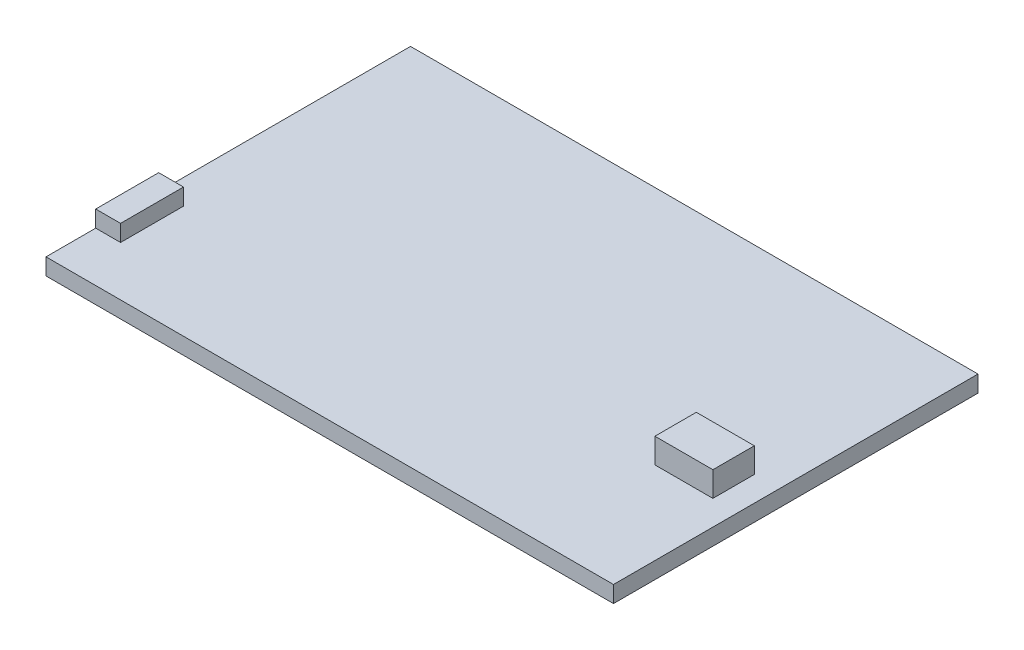
ISO-10303-21;
HEADER;
FILE_DESCRIPTION(('STEP AP214'),'2;1');
FILE_NAME('part.step','',(''),(''),'','','');
FILE_SCHEMA(('AUTOMOTIVE_DESIGN { 1 0 10303 214 1 1 1 1 }'));
ENDSEC;
DATA;
#1=APPLICATION_CONTEXT('core data for automotive mechanical design processes');
#2=APPLICATION_PROTOCOL_DEFINITION('international standard','automotive_design',2000,#1);
#3=PRODUCT_CONTEXT('',#1,'mechanical');
#4=PRODUCT('Part','Part','',(#3));
#5=PRODUCT_RELATED_PRODUCT_CATEGORY('part','',(#4));
#6=PRODUCT_DEFINITION_FORMATION('','',#4);
#7=PRODUCT_DEFINITION_CONTEXT('part definition',#1,'design');
#8=PRODUCT_DEFINITION('design','',#6,#7);
#9=PRODUCT_DEFINITION_SHAPE('','',#8);
#10=(LENGTH_UNIT() NAMED_UNIT(*) SI_UNIT(.MILLI.,.METRE.));
#11=(NAMED_UNIT(*) PLANE_ANGLE_UNIT() SI_UNIT($,.RADIAN.));
#12=(NAMED_UNIT(*) SI_UNIT($,.STERADIAN.) SOLID_ANGLE_UNIT());
#13=UNCERTAINTY_MEASURE_WITH_UNIT(LENGTH_MEASURE(1.E-05),#10,'distance_accuracy_value','');
#14=(GEOMETRIC_REPRESENTATION_CONTEXT(3) GLOBAL_UNCERTAINTY_ASSIGNED_CONTEXT((#13)) GLOBAL_UNIT_ASSIGNED_CONTEXT((#10,
#11,#12)) REPRESENTATION_CONTEXT('',''));
#15=CARTESIAN_POINT('',(0.,0.,0.));
#16=DIRECTION('',(0.,0.,1.));
#17=DIRECTION('',(1.,0.,0.));
#18=AXIS2_PLACEMENT_3D('',#15,#16,#17);
#19=CARTESIAN_POINT('',(0.,2.,0.));
#20=DIRECTION('',(0.,-1.,0.));
#21=DIRECTION('',(0.,0.,-1.));
#22=AXIS2_PLACEMENT_3D('',#19,#20,#21);
#23=PLANE('',#22);
#24=DIRECTION('',(0.,0.,-1.));
#25=VECTOR('',#24,1.);
#26=CARTESIAN_POINT('',(31.25,2.,1.99999999999999));
#27=LINE('',#26,#25);
#28=CARTESIAN_POINT('',(31.25,2.,7.));
#29=VERTEX_POINT('',#28);
#30=CARTESIAN_POINT('',(31.25,2.,1.99999999999999));
#31=VERTEX_POINT('',#30);
#32=EDGE_CURVE('E144',#29,#31,#27,.T.);
#33=ORIENTED_EDGE('',*,*,#32,.F.);
#34=DIRECTION('',(1.,0.,0.));
#35=VECTOR('',#34,1.);
#36=CARTESIAN_POINT('',(31.25,2.,7.));
#37=LINE('',#36,#35);
#38=CARTESIAN_POINT('',(24.25,2.,7.));
#39=VERTEX_POINT('',#38);
#40=EDGE_CURVE('E157',#39,#29,#37,.T.);
#41=ORIENTED_EDGE('',*,*,#40,.F.);
#42=DIRECTION('',(0.,0.,1.));
#43=VECTOR('',#42,1.);
#44=CARTESIAN_POINT('',(24.25,2.,2.));
#45=LINE('',#44,#43);
#46=CARTESIAN_POINT('',(24.25,2.,2.));
#47=VERTEX_POINT('',#46);
#48=EDGE_CURVE('E166',#47,#39,#45,.T.);
#49=ORIENTED_EDGE('',*,*,#48,.F.);
#50=DIRECTION('',(-1.,0.,0.));
#51=VECTOR('',#50,1.);
#52=CARTESIAN_POINT('',(31.25,2.,1.99999999999999));
#53=LINE('',#52,#51);
#54=EDGE_CURVE('E147',#31,#47,#53,.T.);
#55=ORIENTED_EDGE('',*,*,#54,.F.);
#56=EDGE_LOOP('',(#33,#41,#49,#55));
#57=FACE_BOUND('',#56,.T.);
#58=DIRECTION('',(1.,0.,0.));
#59=VECTOR('',#58,1.);
#60=CARTESIAN_POINT('',(-34.25,2.,16.));
#61=LINE('',#60,#59);
#62=CARTESIAN_POINT('',(-34.25,2.,16.));
#63=VERTEX_POINT('',#62);
#64=CARTESIAN_POINT('',(-31.25,2.,16.));
#65=VERTEX_POINT('',#64);
#66=EDGE_CURVE('E221',#63,#65,#61,.T.);
#67=ORIENTED_EDGE('',*,*,#66,.F.);
#68=DIRECTION('',(0.,0.,1.));
#69=VECTOR('',#68,1.);
#70=CARTESIAN_POINT('',(-34.25,2.,22.));
#71=LINE('',#70,#69);
#72=CARTESIAN_POINT('',(-34.25,2.,22.));
#73=VERTEX_POINT('',#72);
#74=EDGE_CURVE('E143',#63,#73,#71,.T.);
#75=ORIENTED_EDGE('',*,*,#74,.T.);
#76=DIRECTION('',(1.,0.,0.));
#77=VECTOR('',#76,1.);
#78=CARTESIAN_POINT('',(-34.25,2.,22.));
#79=LINE('',#78,#77);
#80=CARTESIAN_POINT('',(34.25,2.,22.));
#81=VERTEX_POINT('',#80);
#82=EDGE_CURVE('E191',#73,#81,#79,.T.);
#83=ORIENTED_EDGE('',*,*,#82,.T.);
#84=DIRECTION('',(0.,0.,-1.));
#85=VECTOR('',#84,1.);
#86=CARTESIAN_POINT('',(34.25,2.,22.));
#87=LINE('',#86,#85);
#88=CARTESIAN_POINT('',(34.25,2.,-22.));
#89=VERTEX_POINT('',#88);
#90=EDGE_CURVE('E183',#81,#89,#87,.T.);
#91=ORIENTED_EDGE('',*,*,#90,.T.);
#92=DIRECTION('',(-1.,0.,0.));
#93=VECTOR('',#92,1.);
#94=CARTESIAN_POINT('',(-34.25,2.,-22.));
#95=LINE('',#94,#93);
#96=CARTESIAN_POINT('',(-34.25,2.,-22.));
#97=VERTEX_POINT('',#96);
#98=EDGE_CURVE('E186',#89,#97,#95,.T.);
#99=ORIENTED_EDGE('',*,*,#98,.T.);
#100=CARTESIAN_POINT('',(-34.25,2.,8.4));
#101=VERTEX_POINT('',#100);
#102=EDGE_CURVE('E189',#97,#101,#71,.T.);
#103=ORIENTED_EDGE('',*,*,#102,.T.);
#104=DIRECTION('',(-1.,0.,0.));
#105=VECTOR('',#104,1.);
#106=CARTESIAN_POINT('',(-34.25,2.,8.4));
#107=LINE('',#106,#105);
#108=CARTESIAN_POINT('',(-31.25,2.,8.4));
#109=VERTEX_POINT('',#108);
#110=EDGE_CURVE('E53',#109,#101,#107,.T.);
#111=ORIENTED_EDGE('',*,*,#110,.F.);
#112=DIRECTION('',(0.,0.,-1.));
#113=VECTOR('',#112,1.);
#114=CARTESIAN_POINT('',(-31.25,2.,16.));
#115=LINE('',#114,#113);
#116=EDGE_CURVE('E48',#65,#109,#115,.T.);
#117=ORIENTED_EDGE('',*,*,#116,.F.);
#118=EDGE_LOOP('',(#67,#75,#83,#91,#99,#103,#111,#117));
#119=FACE_BOUND('',#118,.T.);
#120=ADVANCED_FACE('F33',(#57,#119),#23,.F.);
#121=CARTESIAN_POINT('',(34.25,2.,22.));
#122=DIRECTION('',(-1.,0.,0.));
#123=DIRECTION('',(0.,0.,1.));
#124=AXIS2_PLACEMENT_3D('',#121,#122,#123);
#125=PLANE('',#124);
#126=DIRECTION('',(0.,0.,-1.));
#127=VECTOR('',#126,1.);
#128=CARTESIAN_POINT('',(34.25,0.,22.));
#129=LINE('',#128,#127);
#130=CARTESIAN_POINT('',(34.25,0.,22.));
#131=VERTEX_POINT('',#130);
#132=CARTESIAN_POINT('',(34.25,0.,-22.));
#133=VERTEX_POINT('',#132);
#134=EDGE_CURVE('E182',#131,#133,#129,.T.);
#135=ORIENTED_EDGE('',*,*,#134,.T.);
#136=DIRECTION('',(0.,-1.,0.));
#137=VECTOR('',#136,1.);
#138=CARTESIAN_POINT('',(34.25,2.,-22.));
#139=LINE('',#138,#137);
#140=EDGE_CURVE('E11',#89,#133,#139,.T.);
#141=ORIENTED_EDGE('',*,*,#140,.F.);
#142=ORIENTED_EDGE('',*,*,#90,.F.);
#143=DIRECTION('',(0.,-1.,0.));
#144=VECTOR('',#143,1.);
#145=CARTESIAN_POINT('',(34.25,2.,22.));
#146=LINE('',#145,#144);
#147=EDGE_CURVE('E193',#81,#131,#146,.T.);
#148=ORIENTED_EDGE('',*,*,#147,.T.);
#149=EDGE_LOOP('',(#135,#141,#142,#148));
#150=FACE_BOUND('',#149,.T.);
#151=ADVANCED_FACE('F35',(#150),#125,.F.);
#152=CARTESIAN_POINT('',(-34.25,2.,-22.));
#153=DIRECTION('',(0.,0.,1.));
#154=DIRECTION('',(1.,0.,0.));
#155=AXIS2_PLACEMENT_3D('',#152,#153,#154);
#156=PLANE('',#155);
#157=DIRECTION('',(-1.,0.,0.));
#158=VECTOR('',#157,1.);
#159=CARTESIAN_POINT('',(-34.25,0.,-22.));
#160=LINE('',#159,#158);
#161=CARTESIAN_POINT('',(-34.25,0.,-22.));
#162=VERTEX_POINT('',#161);
#163=EDGE_CURVE('E196',#133,#162,#160,.T.);
#164=ORIENTED_EDGE('',*,*,#163,.T.);
#165=DIRECTION('',(0.,-1.,0.));
#166=VECTOR('',#165,1.);
#167=CARTESIAN_POINT('',(-34.25,2.,-22.));
#168=LINE('',#167,#166);
#169=EDGE_CURVE('E41',#97,#162,#168,.T.);
#170=ORIENTED_EDGE('',*,*,#169,.F.);
#171=ORIENTED_EDGE('',*,*,#98,.F.);
#172=ORIENTED_EDGE('',*,*,#140,.T.);
#173=EDGE_LOOP('',(#164,#170,#171,#172));
#174=FACE_BOUND('',#173,.T.);
#175=ADVANCED_FACE('F250',(#174),#156,.F.);
#176=CARTESIAN_POINT('',(-34.25,2.,22.));
#177=DIRECTION('',(1.,0.,0.));
#178=DIRECTION('',(0.,0.,-1.));
#179=AXIS2_PLACEMENT_3D('',#176,#177,#178);
#180=PLANE('',#179);
#181=DIRECTION('',(0.,0.,1.));
#182=VECTOR('',#181,1.);
#183=CARTESIAN_POINT('',(-34.25,0.,22.));
#184=LINE('',#183,#182);
#185=CARTESIAN_POINT('',(-34.25,0.,22.));
#186=VERTEX_POINT('',#185);
#187=EDGE_CURVE('E198',#162,#186,#184,.T.);
#188=ORIENTED_EDGE('',*,*,#187,.T.);
#189=DIRECTION('',(0.,-1.,0.));
#190=VECTOR('',#189,1.);
#191=CARTESIAN_POINT('',(-34.25,2.,22.));
#192=LINE('',#191,#190);
#193=EDGE_CURVE('E203',#73,#186,#192,.T.);
#194=ORIENTED_EDGE('',*,*,#193,.F.);
#195=ORIENTED_EDGE('',*,*,#74,.F.);
#196=DIRECTION('',(0.,-1.,0.));
#197=VECTOR('',#196,1.);
#198=CARTESIAN_POINT('',(-34.25,4.,16.));
#199=LINE('',#198,#197);
#200=CARTESIAN_POINT('',(-34.25,4.,16.));
#201=VERTEX_POINT('',#200);
#202=EDGE_CURVE('E125',#201,#63,#199,.T.);
#203=ORIENTED_EDGE('',*,*,#202,.F.);
#204=DIRECTION('',(0.,0.,1.));
#205=VECTOR('',#204,1.);
#206=CARTESIAN_POINT('',(-34.25,4.,16.));
#207=LINE('',#206,#205);
#208=CARTESIAN_POINT('',(-34.25,4.,8.4));
#209=VERTEX_POINT('',#208);
#210=EDGE_CURVE('E131',#209,#201,#207,.T.);
#211=ORIENTED_EDGE('',*,*,#210,.F.);
#212=DIRECTION('',(0.,-1.,0.));
#213=VECTOR('',#212,1.);
#214=CARTESIAN_POINT('',(-34.25,4.,8.4));
#215=LINE('',#214,#213);
#216=EDGE_CURVE('E228',#209,#101,#215,.T.);
#217=ORIENTED_EDGE('',*,*,#216,.T.);
#218=ORIENTED_EDGE('',*,*,#102,.F.);
#219=ORIENTED_EDGE('',*,*,#169,.T.);
#220=EDGE_LOOP('',(#188,#194,#195,#203,#211,#217,#218,#219));
#221=FACE_BOUND('',#220,.T.);
#222=ADVANCED_FACE('F141',(#221),#180,.F.);
#223=CARTESIAN_POINT('',(-34.25,2.,22.));
#224=DIRECTION('',(0.,0.,-1.));
#225=DIRECTION('',(-1.,0.,0.));
#226=AXIS2_PLACEMENT_3D('',#223,#224,#225);
#227=PLANE('',#226);
#228=DIRECTION('',(1.,0.,0.));
#229=VECTOR('',#228,1.);
#230=CARTESIAN_POINT('',(-34.25,0.,22.));
#231=LINE('',#230,#229);
#232=EDGE_CURVE('E187',#186,#131,#231,.T.);
#233=ORIENTED_EDGE('',*,*,#232,.T.);
#234=ORIENTED_EDGE('',*,*,#147,.F.);
#235=ORIENTED_EDGE('',*,*,#82,.F.);
#236=ORIENTED_EDGE('',*,*,#193,.T.);
#237=EDGE_LOOP('',(#233,#234,#235,#236));
#238=FACE_BOUND('',#237,.T.);
#239=ADVANCED_FACE('F216',(#238),#227,.F.);
#240=CARTESIAN_POINT('',(0.,0.,0.));
#241=DIRECTION('',(0.,-1.,0.));
#242=DIRECTION('',(0.,0.,-1.));
#243=AXIS2_PLACEMENT_3D('',#240,#241,#242);
#244=PLANE('',#243);
#245=ORIENTED_EDGE('',*,*,#134,.F.);
#246=ORIENTED_EDGE('',*,*,#232,.F.);
#247=ORIENTED_EDGE('',*,*,#187,.F.);
#248=ORIENTED_EDGE('',*,*,#163,.F.);
#249=EDGE_LOOP('',(#245,#246,#247,#248));
#250=FACE_BOUND('',#249,.T.);
#251=ADVANCED_FACE('F213',(#250),#244,.T.);
#252=CARTESIAN_POINT('',(31.25,5.,1.99999999999999));
#253=DIRECTION('',(-1.,0.,0.));
#254=DIRECTION('',(0.,0.,1.));
#255=AXIS2_PLACEMENT_3D('',#252,#253,#254);
#256=PLANE('',#255);
#257=ORIENTED_EDGE('',*,*,#32,.T.);
#258=DIRECTION('',(0.,-1.,0.));
#259=VECTOR('',#258,1.);
#260=CARTESIAN_POINT('',(31.25,5.,1.99999999999999));
#261=LINE('',#260,#259);
#262=CARTESIAN_POINT('',(31.25,5.,1.99999999999999));
#263=VERTEX_POINT('',#262);
#264=EDGE_CURVE('E179',#263,#31,#261,.T.);
#265=ORIENTED_EDGE('',*,*,#264,.F.);
#266=DIRECTION('',(0.,0.,-1.));
#267=VECTOR('',#266,1.);
#268=CARTESIAN_POINT('',(31.25,5.,1.99999999999999));
#269=LINE('',#268,#267);
#270=CARTESIAN_POINT('',(31.25,5.,7.));
#271=VERTEX_POINT('',#270);
#272=EDGE_CURVE('E153',#271,#263,#269,.T.);
#273=ORIENTED_EDGE('',*,*,#272,.F.);
#274=DIRECTION('',(0.,-1.,0.));
#275=VECTOR('',#274,1.);
#276=CARTESIAN_POINT('',(31.25,5.,7.));
#277=LINE('',#276,#275);
#278=EDGE_CURVE('E162',#271,#29,#277,.T.);
#279=ORIENTED_EDGE('',*,*,#278,.T.);
#280=EDGE_LOOP('',(#257,#265,#273,#279));
#281=FACE_BOUND('',#280,.T.);
#282=ADVANCED_FACE('F253',(#281),#256,.F.);
#283=CARTESIAN_POINT('',(31.25,5.,1.99999999999999));
#284=DIRECTION('',(0.,0.,1.));
#285=DIRECTION('',(1.,0.,0.));
#286=AXIS2_PLACEMENT_3D('',#283,#284,#285);
#287=PLANE('',#286);
#288=ORIENTED_EDGE('',*,*,#54,.T.);
#289=DIRECTION('',(0.,-1.,0.));
#290=VECTOR('',#289,1.);
#291=CARTESIAN_POINT('',(24.25,5.,2.));
#292=LINE('',#291,#290);
#293=CARTESIAN_POINT('',(24.25,5.,2.));
#294=VERTEX_POINT('',#293);
#295=EDGE_CURVE('E176',#294,#47,#292,.T.);
#296=ORIENTED_EDGE('',*,*,#295,.F.);
#297=DIRECTION('',(-1.,0.,0.));
#298=VECTOR('',#297,1.);
#299=CARTESIAN_POINT('',(31.25,5.,1.99999999999999));
#300=LINE('',#299,#298);
#301=EDGE_CURVE('E156',#263,#294,#300,.T.);
#302=ORIENTED_EDGE('',*,*,#301,.F.);
#303=ORIENTED_EDGE('',*,*,#264,.T.);
#304=EDGE_LOOP('',(#288,#296,#302,#303));
#305=FACE_BOUND('',#304,.T.);
#306=ADVANCED_FACE('F284',(#305),#287,.F.);
#307=CARTESIAN_POINT('',(24.25,5.,2.));
#308=DIRECTION('',(1.,0.,0.));
#309=DIRECTION('',(0.,0.,-1.));
#310=AXIS2_PLACEMENT_3D('',#307,#308,#309);
#311=PLANE('',#310);
#312=ORIENTED_EDGE('',*,*,#48,.T.);
#313=DIRECTION('',(0.,-1.,0.));
#314=VECTOR('',#313,1.);
#315=CARTESIAN_POINT('',(24.25,5.,7.));
#316=LINE('',#315,#314);
#317=CARTESIAN_POINT('',(24.25,5.,7.));
#318=VERTEX_POINT('',#317);
#319=EDGE_CURVE('E173',#318,#39,#316,.T.);
#320=ORIENTED_EDGE('',*,*,#319,.F.);
#321=DIRECTION('',(0.,0.,1.));
#322=VECTOR('',#321,1.);
#323=CARTESIAN_POINT('',(24.25,5.,2.));
#324=LINE('',#323,#322);
#325=EDGE_CURVE('E159',#294,#318,#324,.T.);
#326=ORIENTED_EDGE('',*,*,#325,.F.);
#327=ORIENTED_EDGE('',*,*,#295,.T.);
#328=EDGE_LOOP('',(#312,#320,#326,#327));
#329=FACE_BOUND('',#328,.T.);
#330=ADVANCED_FACE('F291',(#329),#311,.F.);
#331=CARTESIAN_POINT('',(31.25,5.,7.));
#332=DIRECTION('',(0.,0.,-1.));
#333=DIRECTION('',(-1.,0.,0.));
#334=AXIS2_PLACEMENT_3D('',#331,#332,#333);
#335=PLANE('',#334);
#336=ORIENTED_EDGE('',*,*,#40,.T.);
#337=ORIENTED_EDGE('',*,*,#278,.F.);
#338=DIRECTION('',(1.,0.,0.));
#339=VECTOR('',#338,1.);
#340=CARTESIAN_POINT('',(31.25,5.,7.));
#341=LINE('',#340,#339);
#342=EDGE_CURVE('E161',#318,#271,#341,.T.);
#343=ORIENTED_EDGE('',*,*,#342,.F.);
#344=ORIENTED_EDGE('',*,*,#319,.T.);
#345=EDGE_LOOP('',(#336,#337,#343,#344));
#346=FACE_BOUND('',#345,.T.);
#347=ADVANCED_FACE('F298',(#346),#335,.F.);
#348=CARTESIAN_POINT('',(0.,5.,0.));
#349=DIRECTION('',(0.,-1.,0.));
#350=DIRECTION('',(0.,0.,-1.));
#351=AXIS2_PLACEMENT_3D('',#348,#349,#350);
#352=PLANE('',#351);
#353=ORIENTED_EDGE('',*,*,#272,.T.);
#354=ORIENTED_EDGE('',*,*,#301,.T.);
#355=ORIENTED_EDGE('',*,*,#325,.T.);
#356=ORIENTED_EDGE('',*,*,#342,.T.);
#357=EDGE_LOOP('',(#353,#354,#355,#356));
#358=FACE_BOUND('',#357,.T.);
#359=ADVANCED_FACE('F242',(#358),#352,.F.);
#360=CARTESIAN_POINT('',(-34.25,4.,16.));
#361=DIRECTION('',(0.,0.,-1.));
#362=DIRECTION('',(-1.,0.,0.));
#363=AXIS2_PLACEMENT_3D('',#360,#361,#362);
#364=PLANE('',#363);
#365=ORIENTED_EDGE('',*,*,#66,.T.);
#366=DIRECTION('',(0.,-1.,0.));
#367=VECTOR('',#366,1.);
#368=CARTESIAN_POINT('',(-31.25,4.,16.));
#369=LINE('',#368,#367);
#370=CARTESIAN_POINT('',(-31.25,4.,16.));
#371=VERTEX_POINT('',#370);
#372=EDGE_CURVE('E127',#371,#65,#369,.T.);
#373=ORIENTED_EDGE('',*,*,#372,.F.);
#374=DIRECTION('',(1.,0.,0.));
#375=VECTOR('',#374,1.);
#376=CARTESIAN_POINT('',(-34.25,4.,16.));
#377=LINE('',#376,#375);
#378=EDGE_CURVE('E121',#201,#371,#377,.T.);
#379=ORIENTED_EDGE('',*,*,#378,.F.);
#380=ORIENTED_EDGE('',*,*,#202,.T.);
#381=EDGE_LOOP('',(#365,#373,#379,#380));
#382=FACE_BOUND('',#381,.T.);
#383=ADVANCED_FACE('F123',(#382),#364,.F.);
#384=CARTESIAN_POINT('',(-31.25,4.,16.));
#385=DIRECTION('',(-1.,0.,0.));
#386=DIRECTION('',(0.,0.,1.));
#387=AXIS2_PLACEMENT_3D('',#384,#385,#386);
#388=PLANE('',#387);
#389=ORIENTED_EDGE('',*,*,#116,.T.);
#390=DIRECTION('',(0.,-1.,0.));
#391=VECTOR('',#390,1.);
#392=CARTESIAN_POINT('',(-31.25,4.,8.4));
#393=LINE('',#392,#391);
#394=CARTESIAN_POINT('',(-31.25,4.,8.4));
#395=VERTEX_POINT('',#394);
#396=EDGE_CURVE('E149',#395,#109,#393,.T.);
#397=ORIENTED_EDGE('',*,*,#396,.F.);
#398=DIRECTION('',(0.,0.,-1.));
#399=VECTOR('',#398,1.);
#400=CARTESIAN_POINT('',(-31.25,4.,16.));
#401=LINE('',#400,#399);
#402=EDGE_CURVE('E130',#371,#395,#401,.T.);
#403=ORIENTED_EDGE('',*,*,#402,.F.);
#404=ORIENTED_EDGE('',*,*,#372,.T.);
#405=EDGE_LOOP('',(#389,#397,#403,#404));
#406=FACE_BOUND('',#405,.T.);
#407=ADVANCED_FACE('F234',(#406),#388,.F.);
#408=CARTESIAN_POINT('',(-34.25,4.,8.4));
#409=DIRECTION('',(0.,0.,1.));
#410=DIRECTION('',(1.,0.,0.));
#411=AXIS2_PLACEMENT_3D('',#408,#409,#410);
#412=PLANE('',#411);
#413=ORIENTED_EDGE('',*,*,#110,.T.);
#414=ORIENTED_EDGE('',*,*,#216,.F.);
#415=DIRECTION('',(-1.,0.,0.));
#416=VECTOR('',#415,1.);
#417=CARTESIAN_POINT('',(-34.25,4.,8.4));
#418=LINE('',#417,#416);
#419=EDGE_CURVE('E136',#395,#209,#418,.T.);
#420=ORIENTED_EDGE('',*,*,#419,.F.);
#421=ORIENTED_EDGE('',*,*,#396,.T.);
#422=EDGE_LOOP('',(#413,#414,#420,#421));
#423=FACE_BOUND('',#422,.T.);
#424=ADVANCED_FACE('F232',(#423),#412,.F.);
#425=CARTESIAN_POINT('',(0.,4.,0.));
#426=DIRECTION('',(0.,-1.,0.));
#427=DIRECTION('',(0.,0.,-1.));
#428=AXIS2_PLACEMENT_3D('',#425,#426,#427);
#429=PLANE('',#428);
#430=ORIENTED_EDGE('',*,*,#210,.T.);
#431=ORIENTED_EDGE('',*,*,#378,.T.);
#432=ORIENTED_EDGE('',*,*,#402,.T.);
#433=ORIENTED_EDGE('',*,*,#419,.T.);
#434=EDGE_LOOP('',(#430,#431,#432,#433));
#435=FACE_BOUND('',#434,.T.);
#436=ADVANCED_FACE('F134',(#435),#429,.F.);
#437=CLOSED_SHELL('',(#120,#151,#175,#222,#239,#251,#282,#306,#330,#347,#359,#383,#407,#424,#436));
#438=MANIFOLD_SOLID_BREP('B2',#437);
#439=ADVANCED_BREP_SHAPE_REPRESENTATION('',(#18,#438),#14);
#440=SHAPE_DEFINITION_REPRESENTATION(#9,#439);
ENDSEC;
END-ISO-10303-21;
